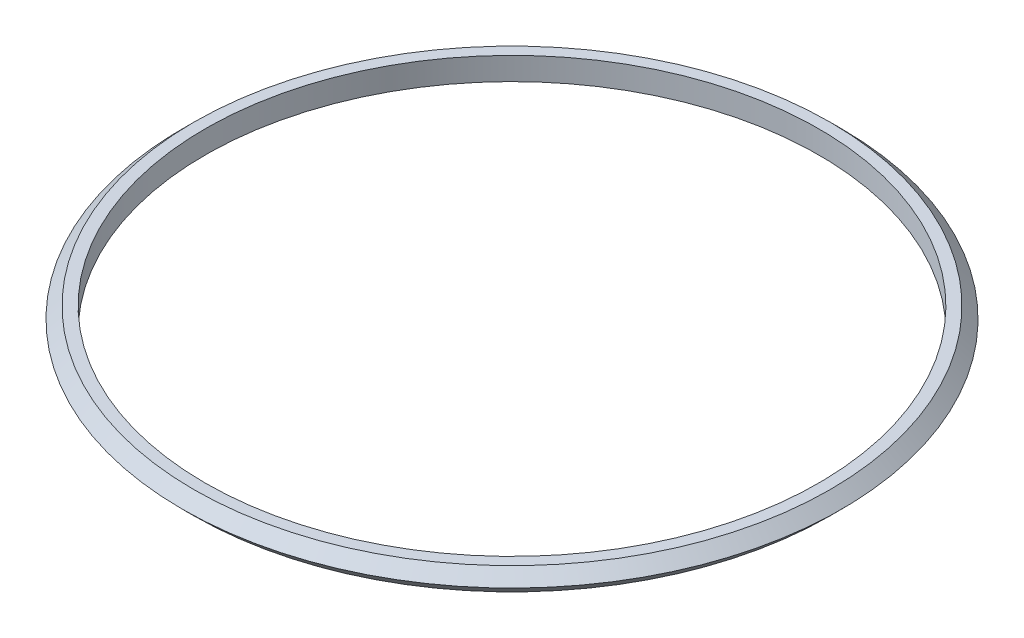
ISO-10303-21;
HEADER;
FILE_DESCRIPTION(('STEP AP214'),'2;1');
FILE_NAME('part.step','',(''),(''),'','','');
FILE_SCHEMA(('AUTOMOTIVE_DESIGN { 1 0 10303 214 1 1 1 1 }'));
ENDSEC;
DATA;
#1=APPLICATION_CONTEXT('core data for automotive mechanical design processes');
#2=APPLICATION_PROTOCOL_DEFINITION('international standard','automotive_design',2000,#1);
#3=PRODUCT_CONTEXT('',#1,'mechanical');
#4=PRODUCT('Part','Part','',(#3));
#5=PRODUCT_RELATED_PRODUCT_CATEGORY('part','',(#4));
#6=PRODUCT_DEFINITION_FORMATION('','',#4);
#7=PRODUCT_DEFINITION_CONTEXT('part definition',#1,'design');
#8=PRODUCT_DEFINITION('design','',#6,#7);
#9=PRODUCT_DEFINITION_SHAPE('','',#8);
#10=(LENGTH_UNIT() NAMED_UNIT(*) SI_UNIT(.MILLI.,.METRE.));
#11=(NAMED_UNIT(*) PLANE_ANGLE_UNIT() SI_UNIT($,.RADIAN.));
#12=(NAMED_UNIT(*) SI_UNIT($,.STERADIAN.) SOLID_ANGLE_UNIT());
#13=UNCERTAINTY_MEASURE_WITH_UNIT(LENGTH_MEASURE(1.E-05),#10,'distance_accuracy_value','');
#14=(GEOMETRIC_REPRESENTATION_CONTEXT(3) GLOBAL_UNCERTAINTY_ASSIGNED_CONTEXT((#13)) GLOBAL_UNIT_ASSIGNED_CONTEXT((#10,
#11,#12)) REPRESENTATION_CONTEXT('',''));
#15=CARTESIAN_POINT('',(0.,0.,0.));
#16=DIRECTION('',(0.,0.,1.));
#17=DIRECTION('',(1.,0.,0.));
#18=AXIS2_PLACEMENT_3D('',#15,#16,#17);
#19=CARTESIAN_POINT('',(0.,1.,0.));
#20=DIRECTION('',(0.,1.,0.));
#21=DIRECTION('',(0.,0.,1.));
#22=AXIS2_PLACEMENT_3D('',#19,#20,#21);
#23=PLANE('',#22);
#24=CARTESIAN_POINT('',(0.,1.,0.));
#25=DIRECTION('',(0.,1.,0.));
#26=DIRECTION('',(0.,0.,1.));
#27=AXIS2_PLACEMENT_3D('',#24,#25,#26);
#28=CIRCLE('',#27,14.);
#29=CARTESIAN_POINT('',(0.,1.,14.));
#30=VERTEX_POINT('',#29);
#31=EDGE_CURVE('E10',#30,#30,#28,.T.);
#32=ORIENTED_EDGE('',*,*,#31,.T.);
#33=EDGE_LOOP('',(#32));
#34=FACE_BOUND('',#33,.T.);
#35=CARTESIAN_POINT('',(0.,1.,0.));
#36=DIRECTION('',(0.,1.,0.));
#37=DIRECTION('',(0.,0.,1.));
#38=AXIS2_PLACEMENT_3D('',#35,#36,#37);
#39=CIRCLE('',#38,13.5);
#40=CARTESIAN_POINT('',(0.,1.,13.5));
#41=VERTEX_POINT('',#40);
#42=EDGE_CURVE('E60',#41,#41,#39,.T.);
#43=ORIENTED_EDGE('',*,*,#42,.F.);
#44=EDGE_LOOP('',(#43));
#45=FACE_BOUND('',#44,.T.);
#46=ADVANCED_FACE('F45',(#34,#45),#23,.T.);
#47=CARTESIAN_POINT('',(0.,0.,0.));
#48=DIRECTION('',(0.,1.,0.));
#49=DIRECTION('',(0.,0.,1.));
#50=AXIS2_PLACEMENT_3D('',#47,#48,#49);
#51=PLANE('',#50);
#52=CARTESIAN_POINT('',(0.,0.,0.));
#53=DIRECTION('',(0.,1.,0.));
#54=DIRECTION('',(0.,0.,1.));
#55=AXIS2_PLACEMENT_3D('',#52,#53,#54);
#56=CIRCLE('',#55,14.);
#57=CARTESIAN_POINT('',(0.,0.,14.));
#58=VERTEX_POINT('',#57);
#59=EDGE_CURVE('E55',#58,#58,#56,.F.);
#60=ORIENTED_EDGE('',*,*,#59,.T.);
#61=EDGE_LOOP('',(#60));
#62=FACE_BOUND('',#61,.T.);
#63=CARTESIAN_POINT('',(0.,0.,0.));
#64=DIRECTION('',(0.,1.,0.));
#65=DIRECTION('',(0.,0.,1.));
#66=AXIS2_PLACEMENT_3D('',#63,#64,#65);
#67=CIRCLE('',#66,13.5);
#68=CARTESIAN_POINT('',(0.,0.,13.5));
#69=VERTEX_POINT('',#68);
#70=EDGE_CURVE('E63',#69,#69,#67,.T.);
#71=ORIENTED_EDGE('',*,*,#70,.T.);
#72=EDGE_LOOP('',(#71));
#73=FACE_BOUND('',#72,.T.);
#74=ADVANCED_FACE('F75',(#62,#73),#51,.F.);
#75=CARTESIAN_POINT('',(0.,1.,0.));
#76=DIRECTION('',(0.,-1.,0.));
#77=DIRECTION('',(0.,0.,-1.));
#78=AXIS2_PLACEMENT_3D('',#75,#76,#77);
#79=CYLINDRICAL_SURFACE('',#78,13.5);
#80=ORIENTED_EDGE('',*,*,#42,.T.);
#81=EDGE_LOOP('',(#80));
#82=FACE_BOUND('',#81,.T.);
#83=ORIENTED_EDGE('',*,*,#70,.F.);
#84=EDGE_LOOP('',(#83));
#85=FACE_BOUND('',#84,.T.);
#86=ADVANCED_FACE('F71',(#82,#85),#79,.F.);
#87=CARTESIAN_POINT('',(0.,1.,0.));
#88=DIRECTION('',(0.,-1.,0.));
#89=DIRECTION('',(0.,0.,-1.));
#90=AXIS2_PLACEMENT_3D('',#87,#88,#89);
#91=CONICAL_SURFACE('',#90,14.,0.785398163397452);
#92=ORIENTED_EDGE('',*,*,#31,.F.);
#93=EDGE_LOOP('',(#92));
#94=FACE_BOUND('',#93,.T.);
#95=CARTESIAN_POINT('',(0.,0.499999999999994,0.));
#96=DIRECTION('',(0.,1.,0.));
#97=DIRECTION('',(0.,0.,1.));
#98=AXIS2_PLACEMENT_3D('',#95,#96,#97);
#99=CIRCLE('',#98,14.5);
#100=CARTESIAN_POINT('',(0.,0.499999999999994,14.5));
#101=VERTEX_POINT('',#100);
#102=EDGE_CURVE('E50',#101,#101,#99,.F.);
#103=ORIENTED_EDGE('',*,*,#102,.F.);
#104=EDGE_LOOP('',(#103));
#105=FACE_BOUND('',#104,.T.);
#106=ADVANCED_FACE('F48',(#94,#105),#91,.T.);
#107=CARTESIAN_POINT('',(0.,0.500000000000004,0.));
#108=DIRECTION('',(0.,1.,0.));
#109=DIRECTION('',(0.,0.,1.));
#110=AXIS2_PLACEMENT_3D('',#107,#108,#109);
#111=CONICAL_SURFACE('',#110,14.5,0.785398163397452);
#112=ORIENTED_EDGE('',*,*,#59,.F.);
#113=EDGE_LOOP('',(#112));
#114=FACE_BOUND('',#113,.T.);
#115=ORIENTED_EDGE('',*,*,#102,.T.);
#116=EDGE_LOOP('',(#115));
#117=FACE_BOUND('',#116,.T.);
#118=ADVANCED_FACE('F85',(#114,#117),#111,.T.);
#119=CLOSED_SHELL('',(#46,#74,#86,#106,#118));
#120=MANIFOLD_SOLID_BREP('B2',#119);
#121=ADVANCED_BREP_SHAPE_REPRESENTATION('',(#18,#120),#14);
#122=SHAPE_DEFINITION_REPRESENTATION(#9,#121);
ENDSEC;
END-ISO-10303-21;
